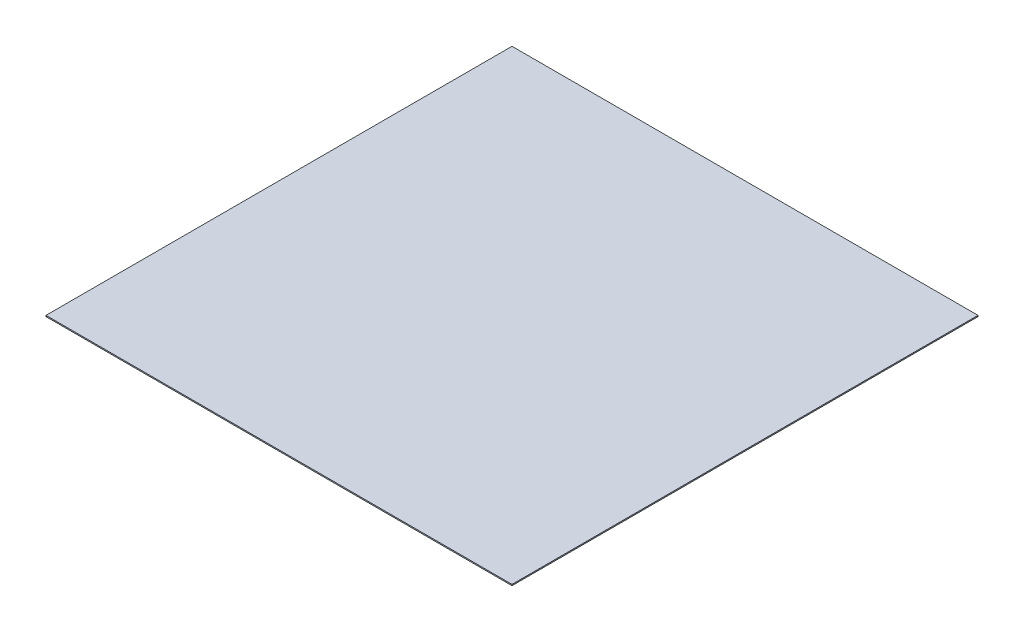
ISO-10303-21;
HEADER;
FILE_DESCRIPTION(('STEP AP214'),'2;1');
FILE_NAME('part.step','',(''),(''),'','','');
FILE_SCHEMA(('AUTOMOTIVE_DESIGN { 1 0 10303 214 1 1 1 1 }'));
ENDSEC;
DATA;
#1=APPLICATION_CONTEXT('core data for automotive mechanical design processes');
#2=APPLICATION_PROTOCOL_DEFINITION('international standard','automotive_design',2000,#1);
#3=PRODUCT_CONTEXT('',#1,'mechanical');
#4=PRODUCT('Part','Part','',(#3));
#5=PRODUCT_RELATED_PRODUCT_CATEGORY('part','',(#4));
#6=PRODUCT_DEFINITION_FORMATION('','',#4);
#7=PRODUCT_DEFINITION_CONTEXT('part definition',#1,'design');
#8=PRODUCT_DEFINITION('design','',#6,#7);
#9=PRODUCT_DEFINITION_SHAPE('','',#8);
#10=(LENGTH_UNIT() NAMED_UNIT(*) SI_UNIT(.MILLI.,.METRE.));
#11=(NAMED_UNIT(*) PLANE_ANGLE_UNIT() SI_UNIT($,.RADIAN.));
#12=(NAMED_UNIT(*) SI_UNIT($,.STERADIAN.) SOLID_ANGLE_UNIT());
#13=UNCERTAINTY_MEASURE_WITH_UNIT(LENGTH_MEASURE(1.E-05),#10,'distance_accuracy_value','');
#14=(GEOMETRIC_REPRESENTATION_CONTEXT(3) GLOBAL_UNCERTAINTY_ASSIGNED_CONTEXT((#13)) GLOBAL_UNIT_ASSIGNED_CONTEXT((#10,
#11,#12)) REPRESENTATION_CONTEXT('',''));
#15=CARTESIAN_POINT('',(0.,0.,0.));
#16=DIRECTION('',(0.,0.,1.));
#17=DIRECTION('',(1.,0.,0.));
#18=AXIS2_PLACEMENT_3D('',#15,#16,#17);
#19=CARTESIAN_POINT('',(200.000000000002,1.,200.));
#20=DIRECTION('',(-1.,0.,0.));
#21=DIRECTION('',(0.,0.,1.));
#22=AXIS2_PLACEMENT_3D('',#19,#20,#21);
#23=PLANE('',#22);
#24=DIRECTION('',(0.,0.,-1.));
#25=VECTOR('',#24,1.);
#26=CARTESIAN_POINT('',(200.000000000002,0.,200.));
#27=LINE('',#26,#25);
#28=CARTESIAN_POINT('',(200.000000000002,0.,200.));
#29=VERTEX_POINT('',#28);
#30=CARTESIAN_POINT('',(200.000000000002,0.,-200.));
#31=VERTEX_POINT('',#30);
#32=EDGE_CURVE('E107',#29,#31,#27,.T.);
#33=ORIENTED_EDGE('',*,*,#32,.T.);
#34=DIRECTION('',(0.,-1.,0.));
#35=VECTOR('',#34,1.);
#36=CARTESIAN_POINT('',(200.000000000002,1.,-200.));
#37=LINE('',#36,#35);
#38=CARTESIAN_POINT('',(200.000000000002,1.,-200.));
#39=VERTEX_POINT('',#38);
#40=EDGE_CURVE('E11',#39,#31,#37,.T.);
#41=ORIENTED_EDGE('',*,*,#40,.F.);
#42=DIRECTION('',(0.,0.,-1.));
#43=VECTOR('',#42,1.);
#44=CARTESIAN_POINT('',(200.000000000002,1.,200.));
#45=LINE('',#44,#43);
#46=CARTESIAN_POINT('',(200.000000000002,1.,200.));
#47=VERTEX_POINT('',#46);
#48=EDGE_CURVE('E91',#47,#39,#45,.T.);
#49=ORIENTED_EDGE('',*,*,#48,.F.);
#50=DIRECTION('',(0.,-1.,0.));
#51=VECTOR('',#50,1.);
#52=CARTESIAN_POINT('',(200.000000000002,1.,200.));
#53=LINE('',#52,#51);
#54=EDGE_CURVE('E103',#47,#29,#53,.T.);
#55=ORIENTED_EDGE('',*,*,#54,.T.);
#56=EDGE_LOOP('',(#33,#41,#49,#55));
#57=FACE_BOUND('',#56,.T.);
#58=ADVANCED_FACE('F39',(#57),#23,.F.);
#59=CARTESIAN_POINT('',(-199.999999999998,1.,-200.));
#60=DIRECTION('',(0.,0.,1.));
#61=DIRECTION('',(1.,0.,0.));
#62=AXIS2_PLACEMENT_3D('',#59,#60,#61);
#63=PLANE('',#62);
#64=DIRECTION('',(-1.,0.,0.));
#65=VECTOR('',#64,1.);
#66=CARTESIAN_POINT('',(-199.999999999998,0.,-200.));
#67=LINE('',#66,#65);
#68=CARTESIAN_POINT('',(-199.999999999998,0.,-200.));
#69=VERTEX_POINT('',#68);
#70=EDGE_CURVE('E96',#31,#69,#67,.T.);
#71=ORIENTED_EDGE('',*,*,#70,.T.);
#72=DIRECTION('',(0.,-1.,0.));
#73=VECTOR('',#72,1.);
#74=CARTESIAN_POINT('',(-199.999999999998,1.,-200.));
#75=LINE('',#74,#73);
#76=CARTESIAN_POINT('',(-199.999999999998,1.,-200.));
#77=VERTEX_POINT('',#76);
#78=EDGE_CURVE('E48',#77,#69,#75,.T.);
#79=ORIENTED_EDGE('',*,*,#78,.F.);
#80=DIRECTION('',(-1.,0.,0.));
#81=VECTOR('',#80,1.);
#82=CARTESIAN_POINT('',(-199.999999999998,1.,-200.));
#83=LINE('',#82,#81);
#84=EDGE_CURVE('E86',#39,#77,#83,.T.);
#85=ORIENTED_EDGE('',*,*,#84,.F.);
#86=ORIENTED_EDGE('',*,*,#40,.T.);
#87=EDGE_LOOP('',(#71,#79,#85,#86));
#88=FACE_BOUND('',#87,.T.);
#89=ADVANCED_FACE('F95',(#88),#63,.F.);
#90=CARTESIAN_POINT('',(-199.999999999998,1.,200.));
#91=DIRECTION('',(1.,0.,0.));
#92=DIRECTION('',(0.,0.,-1.));
#93=AXIS2_PLACEMENT_3D('',#90,#91,#92);
#94=PLANE('',#93);
#95=DIRECTION('',(0.,0.,1.));
#96=VECTOR('',#95,1.);
#97=CARTESIAN_POINT('',(-199.999999999998,0.,200.));
#98=LINE('',#97,#96);
#99=CARTESIAN_POINT('',(-199.999999999998,0.,200.));
#100=VERTEX_POINT('',#99);
#101=EDGE_CURVE('E73',#69,#100,#98,.T.);
#102=ORIENTED_EDGE('',*,*,#101,.T.);
#103=DIRECTION('',(0.,-1.,0.));
#104=VECTOR('',#103,1.);
#105=CARTESIAN_POINT('',(-199.999999999998,1.,200.));
#106=LINE('',#105,#104);
#107=CARTESIAN_POINT('',(-199.999999999998,1.,200.));
#108=VERTEX_POINT('',#107);
#109=EDGE_CURVE('E98',#108,#100,#106,.T.);
#110=ORIENTED_EDGE('',*,*,#109,.F.);
#111=DIRECTION('',(0.,0.,1.));
#112=VECTOR('',#111,1.);
#113=CARTESIAN_POINT('',(-199.999999999998,1.,200.));
#114=LINE('',#113,#112);
#115=EDGE_CURVE('E89',#77,#108,#114,.T.);
#116=ORIENTED_EDGE('',*,*,#115,.F.);
#117=ORIENTED_EDGE('',*,*,#78,.T.);
#118=EDGE_LOOP('',(#102,#110,#116,#117));
#119=FACE_BOUND('',#118,.T.);
#120=ADVANCED_FACE('F99',(#119),#94,.F.);
#121=CARTESIAN_POINT('',(-199.999999999998,1.,200.));
#122=DIRECTION('',(0.,0.,-1.));
#123=DIRECTION('',(-1.,0.,0.));
#124=AXIS2_PLACEMENT_3D('',#121,#122,#123);
#125=PLANE('',#124);
#126=DIRECTION('',(1.,0.,0.));
#127=VECTOR('',#126,1.);
#128=CARTESIAN_POINT('',(-199.999999999998,0.,200.));
#129=LINE('',#128,#127);
#130=EDGE_CURVE('E79',#100,#29,#129,.T.);
#131=ORIENTED_EDGE('',*,*,#130,.T.);
#132=ORIENTED_EDGE('',*,*,#54,.F.);
#133=DIRECTION('',(1.,0.,0.));
#134=VECTOR('',#133,1.);
#135=CARTESIAN_POINT('',(-199.999999999998,1.,200.));
#136=LINE('',#135,#134);
#137=EDGE_CURVE('E56',#108,#47,#136,.T.);
#138=ORIENTED_EDGE('',*,*,#137,.F.);
#139=ORIENTED_EDGE('',*,*,#109,.T.);
#140=EDGE_LOOP('',(#131,#132,#138,#139));
#141=FACE_BOUND('',#140,.T.);
#142=ADVANCED_FACE('F120',(#141),#125,.F.);
#143=CARTESIAN_POINT('',(0.,1.,0.));
#144=DIRECTION('',(0.,-1.,0.));
#145=DIRECTION('',(0.,0.,-1.));
#146=AXIS2_PLACEMENT_3D('',#143,#144,#145);
#147=PLANE('',#146);
#148=ORIENTED_EDGE('',*,*,#48,.T.);
#149=ORIENTED_EDGE('',*,*,#84,.T.);
#150=ORIENTED_EDGE('',*,*,#115,.T.);
#151=ORIENTED_EDGE('',*,*,#137,.T.);
#152=EDGE_LOOP('',(#148,#149,#150,#151));
#153=FACE_BOUND('',#152,.T.);
#154=ADVANCED_FACE('F87',(#153),#147,.F.);
#155=CARTESIAN_POINT('',(0.,0.,0.));
#156=DIRECTION('',(0.,-1.,0.));
#157=DIRECTION('',(0.,0.,-1.));
#158=AXIS2_PLACEMENT_3D('',#155,#156,#157);
#159=PLANE('',#158);
#160=ORIENTED_EDGE('',*,*,#32,.F.);
#161=ORIENTED_EDGE('',*,*,#130,.F.);
#162=ORIENTED_EDGE('',*,*,#101,.F.);
#163=ORIENTED_EDGE('',*,*,#70,.F.);
#164=EDGE_LOOP('',(#160,#161,#162,#163));
#165=FACE_BOUND('',#164,.T.);
#166=ADVANCED_FACE('F123',(#165),#159,.T.);
#167=CLOSED_SHELL('',(#58,#89,#120,#142,#154,#166));
#168=MANIFOLD_SOLID_BREP('B2',#167);
#169=ADVANCED_BREP_SHAPE_REPRESENTATION('',(#18,#168),#14);
#170=SHAPE_DEFINITION_REPRESENTATION(#9,#169);
ENDSEC;
END-ISO-10303-21;
